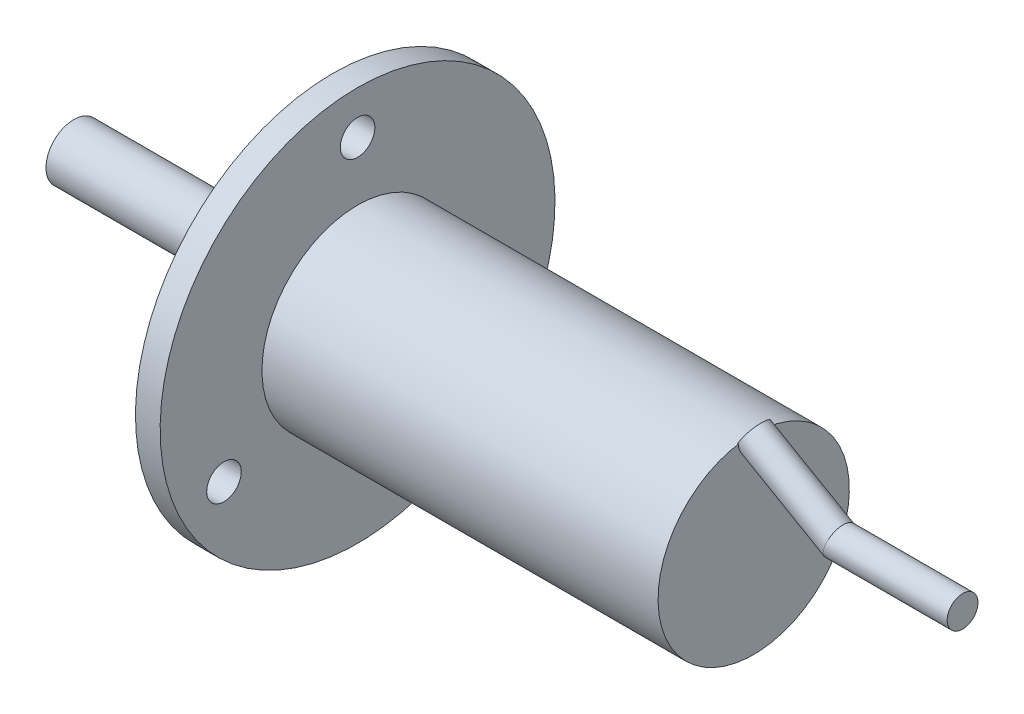
ISO-10303-21;
HEADER;
FILE_DESCRIPTION(('STEP AP214'),'2;1');
FILE_NAME('part.step','',(''),(''),'','','');
FILE_SCHEMA(('AUTOMOTIVE_DESIGN { 1 0 10303 214 1 1 1 1 }'));
ENDSEC;
DATA;
#1=APPLICATION_CONTEXT('core data for automotive mechanical design processes');
#2=APPLICATION_PROTOCOL_DEFINITION('international standard','automotive_design',2000,#1);
#3=PRODUCT_CONTEXT('',#1,'mechanical');
#4=PRODUCT('Part','Part','',(#3));
#5=PRODUCT_RELATED_PRODUCT_CATEGORY('part','',(#4));
#6=PRODUCT_DEFINITION_FORMATION('','',#4);
#7=PRODUCT_DEFINITION_CONTEXT('part definition',#1,'design');
#8=PRODUCT_DEFINITION('design','',#6,#7);
#9=PRODUCT_DEFINITION_SHAPE('','',#8);
#10=(LENGTH_UNIT() NAMED_UNIT(*) SI_UNIT(.MILLI.,.METRE.));
#11=(NAMED_UNIT(*) PLANE_ANGLE_UNIT() SI_UNIT($,.RADIAN.));
#12=(NAMED_UNIT(*) SI_UNIT($,.STERADIAN.) SOLID_ANGLE_UNIT());
#13=UNCERTAINTY_MEASURE_WITH_UNIT(LENGTH_MEASURE(1.E-05),#10,'distance_accuracy_value','');
#14=(GEOMETRIC_REPRESENTATION_CONTEXT(3) GLOBAL_UNCERTAINTY_ASSIGNED_CONTEXT((#13)) GLOBAL_UNIT_ASSIGNED_CONTEXT((#10,
#11,#12)) REPRESENTATION_CONTEXT('',''));
#15=CARTESIAN_POINT('',(0.,0.,0.));
#16=DIRECTION('',(0.,0.,1.));
#17=DIRECTION('',(1.,0.,0.));
#18=AXIS2_PLACEMENT_3D('',#15,#16,#17);
#19=CARTESIAN_POINT('',(57.0282032302755,3.75000000000002,0.));
#20=DIRECTION('',(-1.,0.,0.));
#21=DIRECTION('',(0.,-1.,0.));
#22=AXIS2_PLACEMENT_3D('',#19,#20,#21);
#23=PLANE('',#22);
#24=CARTESIAN_POINT('',(57.0282032302755,3.75000000000002,0.));
#25=DIRECTION('',(-1.,0.,0.));
#26=DIRECTION('',(0.,-1.,0.));
#27=AXIS2_PLACEMENT_3D('',#24,#25,#26);
#28=CIRCLE('',#27,1.25);
#29=CARTESIAN_POINT('',(57.0282032302755,2.50000000000002,0.));
#30=VERTEX_POINT('',#29);
#31=EDGE_CURVE('E59',#30,#30,#28,.T.);
#32=ORIENTED_EDGE('',*,*,#31,.F.);
#33=EDGE_LOOP('',(#32));
#34=FACE_BOUND('',#33,.T.);
#35=ADVANCED_FACE('F56',(#34),#23,.F.);
#36=CARTESIAN_POINT('',(40.1,7.75,0.));
#37=DIRECTION('',(-0.86602540378444,0.499999999999997,0.));
#38=DIRECTION('',(-0.499999999999997,-0.86602540378444,0.));
#39=AXIS2_PLACEMENT_3D('',#36,#37,#38);
#40=PLANE('',#39);
#41=CARTESIAN_POINT('',(40.1,7.75,0.));
#42=DIRECTION('',(-0.86602540378444,0.499999999999997,0.));
#43=DIRECTION('',(-0.499999999999997,-0.86602540378444,0.));
#44=AXIS2_PLACEMENT_3D('',#41,#42,#43);
#45=CIRCLE('',#44,1.25);
#46=CARTESIAN_POINT('',(39.475,6.66746824526945,0.));
#47=VERTEX_POINT('',#46);
#48=EDGE_CURVE('E63',#47,#47,#45,.T.);
#49=ORIENTED_EDGE('',*,*,#48,.T.);
#50=EDGE_LOOP('',(#49));
#51=FACE_BOUND('',#50,.T.);
#52=ADVANCED_FACE('F76',(#51),#40,.T.);
#53=CARTESIAN_POINT('',(46.5597730906827,3.75000000000002,0.));
#54=DIRECTION('',(1.,0.,0.));
#55=DIRECTION('',(0.,1.,0.));
#56=AXIS2_PLACEMENT_3D('',#53,#54,#55);
#57=CYLINDRICAL_SURFACE('',#56,1.25);
#58=CARTESIAN_POINT('',(47.0282032302755,3.75000000000002,0.));
#59=DIRECTION('',(0.965925826289069,-0.258819045102519,0.));
#60=DIRECTION('',(-0.258819045102519,-0.965925826289069,0.));
#61=AXIS2_PLACEMENT_3D('',#58,#59,#60);
#62=ELLIPSE('',#61,1.2940952255126,1.25);
#63=CARTESIAN_POINT('',(46.6932667397366,2.50000000000002,0.));
#64=VERTEX_POINT('',#63);
#65=EDGE_CURVE('E12',#64,#64,#62,.T.);
#66=ORIENTED_EDGE('',*,*,#65,.T.);
#67=EDGE_LOOP('',(#66));
#68=FACE_BOUND('',#67,.T.);
#69=ORIENTED_EDGE('',*,*,#31,.T.);
#70=EDGE_LOOP('',(#69));
#71=FACE_BOUND('',#70,.T.);
#72=ADVANCED_FACE('F73',(#68,#71),#57,.T.);
#73=CARTESIAN_POINT('',(40.1,7.75,0.));
#74=DIRECTION('',(0.86602540378444,-0.499999999999998,0.));
#75=DIRECTION('',(0.499999999999998,0.86602540378444,0.));
#76=AXIS2_PLACEMENT_3D('',#73,#74,#75);
#77=CYLINDRICAL_SURFACE('',#76,1.25);
#78=ORIENTED_EDGE('',*,*,#48,.F.);
#79=EDGE_LOOP('',(#78));
#80=FACE_BOUND('',#79,.T.);
#81=ORIENTED_EDGE('',*,*,#65,.F.);
#82=EDGE_LOOP('',(#81));
#83=FACE_BOUND('',#82,.T.);
#84=ADVANCED_FACE('F80',(#80,#83),#77,.T.);
#85=CLOSED_SHELL('',(#35,#52,#72,#84));
#86=MANIFOLD_SOLID_BREP('B2',#85);
#87=CARTESIAN_POINT('',(-15.,0.,0.));
#88=DIRECTION('',(1.,0.,0.));
#89=DIRECTION('',(0.,1.,0.));
#90=AXIS2_PLACEMENT_3D('',#87,#88,#89);
#91=CYLINDRICAL_SURFACE('',#90,2.25);
#92=CARTESIAN_POINT('',(-15.,0.,0.));
#93=DIRECTION('',(-1.,0.,0.));
#94=DIRECTION('',(0.,-1.,0.));
#95=AXIS2_PLACEMENT_3D('',#92,#93,#94);
#96=CIRCLE('',#95,2.25);
#97=CARTESIAN_POINT('',(-15.,-2.25,0.));
#98=VERTEX_POINT('',#97);
#99=EDGE_CURVE('E55',#98,#98,#96,.T.);
#100=ORIENTED_EDGE('',*,*,#99,.F.);
#101=EDGE_LOOP('',(#100));
#102=FACE_BOUND('',#101,.T.);
#103=CARTESIAN_POINT('',(0.,0.,0.));
#104=DIRECTION('',(-1.,0.,0.));
#105=DIRECTION('',(0.,-1.,0.));
#106=AXIS2_PLACEMENT_3D('',#103,#104,#105);
#107=CIRCLE('',#106,2.25);
#108=CARTESIAN_POINT('',(0.,-2.25,0.));
#109=VERTEX_POINT('',#108);
#110=EDGE_CURVE('E122',#109,#109,#107,.T.);
#111=ORIENTED_EDGE('',*,*,#110,.T.);
#112=EDGE_LOOP('',(#111));
#113=FACE_BOUND('',#112,.T.);
#114=ADVANCED_FACE('F119',(#102,#113),#91,.T.);
#115=CARTESIAN_POINT('',(-15.,0.,0.));
#116=DIRECTION('',(-1.,0.,0.));
#117=DIRECTION('',(0.,-1.,0.));
#118=AXIS2_PLACEMENT_3D('',#115,#116,#117);
#119=PLANE('',#118);
#120=ORIENTED_EDGE('',*,*,#99,.T.);
#121=EDGE_LOOP('',(#120));
#122=FACE_BOUND('',#121,.T.);
#123=ADVANCED_FACE('F134',(#122),#119,.T.);
#124=CARTESIAN_POINT('',(0.,0.,0.));
#125=DIRECTION('',(-1.,0.,0.));
#126=DIRECTION('',(0.,-1.,0.));
#127=AXIS2_PLACEMENT_3D('',#124,#125,#126);
#128=PLANE('',#127);
#129=ORIENTED_EDGE('',*,*,#110,.F.);
#130=EDGE_LOOP('',(#129));
#131=FACE_BOUND('',#130,.T.);
#132=ADVANCED_FACE('F132',(#131),#128,.F.);
#133=CLOSED_SHELL('',(#114,#123,#132));
#134=MANIFOLD_SOLID_BREP('B7',#133);
#135=CARTESIAN_POINT('',(0.,0.,0.));
#136=DIRECTION('',(-1.,0.,0.));
#137=DIRECTION('',(0.,-1.,0.));
#138=AXIS2_PLACEMENT_3D('',#135,#136,#137);
#139=PLANE('',#138);
#140=CARTESIAN_POINT('',(0.,0.,0.));
#141=DIRECTION('',(1.,0.,0.));
#142=DIRECTION('',(0.,1.,0.));
#143=AXIS2_PLACEMENT_3D('',#140,#141,#142);
#144=CIRCLE('',#143,2.99999999999999);
#145=CARTESIAN_POINT('',(0.,2.99999999999999,0.));
#146=VERTEX_POINT('',#145);
#147=EDGE_CURVE('E118',#146,#146,#144,.T.);
#148=ORIENTED_EDGE('',*,*,#147,.F.);
#149=EDGE_LOOP('',(#148));
#150=FACE_BOUND('',#149,.T.);
#151=ADVANCED_FACE('F160',(#150),#139,.T.);
#152=CARTESIAN_POINT('',(40.1,0.,0.));
#153=DIRECTION('',(1.,0.,0.));
#154=DIRECTION('',(0.,1.,0.));
#155=AXIS2_PLACEMENT_3D('',#152,#153,#154);
#156=CYLINDRICAL_SURFACE('',#155,2.99999999999999);
#157=ORIENTED_EDGE('',*,*,#147,.T.);
#158=EDGE_LOOP('',(#157));
#159=FACE_BOUND('',#158,.T.);
#160=CARTESIAN_POINT('',(6.,0.,0.));
#161=DIRECTION('',(1.,0.,0.));
#162=DIRECTION('',(0.,1.,0.));
#163=AXIS2_PLACEMENT_3D('',#160,#161,#162);
#164=CIRCLE('',#163,2.99999999999999);
#165=CARTESIAN_POINT('',(6.,2.99999999999999,0.));
#166=VERTEX_POINT('',#165);
#167=EDGE_CURVE('E167',#166,#166,#164,.T.);
#168=ORIENTED_EDGE('',*,*,#167,.F.);
#169=EDGE_LOOP('',(#168));
#170=FACE_BOUND('',#169,.T.);
#171=ADVANCED_FACE('F208',(#159,#170),#156,.T.);
#172=CARTESIAN_POINT('',(6.,2.99999999999999,0.));
#173=DIRECTION('',(-1.,0.,0.));
#174=DIRECTION('',(0.,-1.,0.));
#175=AXIS2_PLACEMENT_3D('',#172,#173,#174);
#176=PLANE('',#175);
#177=CARTESIAN_POINT('',(6.,12.5,0.));
#178=DIRECTION('',(-1.,0.,0.));
#179=DIRECTION('',(0.,-1.,0.));
#180=AXIS2_PLACEMENT_3D('',#177,#178,#179);
#181=CIRCLE('',#180,1.4);
#182=CARTESIAN_POINT('',(6.,11.1,0.));
#183=VERTEX_POINT('',#182);
#184=EDGE_CURVE('E179',#183,#183,#181,.T.);
#185=ORIENTED_EDGE('',*,*,#184,.F.);
#186=EDGE_LOOP('',(#185));
#187=FACE_BOUND('',#186,.T.);
#188=CARTESIAN_POINT('',(6.,-6.25,10.8253175473055));
#189=DIRECTION('',(-1.,0.,0.));
#190=DIRECTION('',(0.,-1.,0.));
#191=AXIS2_PLACEMENT_3D('',#188,#189,#190);
#192=CIRCLE('',#191,1.40000000000006);
#193=CARTESIAN_POINT('',(6.,-7.65000000000006,10.8253175473055));
#194=VERTEX_POINT('',#193);
#195=EDGE_CURVE('E299',#194,#194,#192,.T.);
#196=ORIENTED_EDGE('',*,*,#195,.F.);
#197=EDGE_LOOP('',(#196));
#198=FACE_BOUND('',#197,.T.);
#199=CARTESIAN_POINT('',(6.,-6.25,-10.8253175473055));
#200=DIRECTION('',(-1.,0.,0.));
#201=DIRECTION('',(0.,-1.,0.));
#202=AXIS2_PLACEMENT_3D('',#199,#200,#201);
#203=CIRCLE('',#202,1.40000000000012);
#204=CARTESIAN_POINT('',(6.,-7.65000000000012,-10.8253175473055));
#205=VERTEX_POINT('',#204);
#206=EDGE_CURVE('E196',#205,#205,#203,.T.);
#207=ORIENTED_EDGE('',*,*,#206,.F.);
#208=EDGE_LOOP('',(#207));
#209=FACE_BOUND('',#208,.T.);
#210=ORIENTED_EDGE('',*,*,#167,.T.);
#211=EDGE_LOOP('',(#210));
#212=FACE_BOUND('',#211,.T.);
#213=CARTESIAN_POINT('',(6.,0.,0.));
#214=DIRECTION('',(1.,0.,0.));
#215=DIRECTION('',(0.,1.,0.));
#216=AXIS2_PLACEMENT_3D('',#213,#214,#215);
#217=CIRCLE('',#216,16.);
#218=CARTESIAN_POINT('',(6.,16.,0.));
#219=VERTEX_POINT('',#218);
#220=EDGE_CURVE('E172',#219,#219,#217,.T.);
#221=ORIENTED_EDGE('',*,*,#220,.F.);
#222=EDGE_LOOP('',(#221));
#223=FACE_BOUND('',#222,.T.);
#224=ADVANCED_FACE('F206',(#187,#198,#209,#212,#223),#176,.T.);
#225=CARTESIAN_POINT('',(40.1,0.,0.));
#226=DIRECTION('',(1.,0.,0.));
#227=DIRECTION('',(0.,1.,0.));
#228=AXIS2_PLACEMENT_3D('',#225,#226,#227);
#229=CYLINDRICAL_SURFACE('',#228,16.);
#230=ORIENTED_EDGE('',*,*,#220,.T.);
#231=EDGE_LOOP('',(#230));
#232=FACE_BOUND('',#231,.T.);
#233=CARTESIAN_POINT('',(8.,0.,0.));
#234=DIRECTION('',(1.,0.,0.));
#235=DIRECTION('',(0.,1.,0.));
#236=AXIS2_PLACEMENT_3D('',#233,#234,#235);
#237=CIRCLE('',#236,16.);
#238=CARTESIAN_POINT('',(8.,16.,0.));
#239=VERTEX_POINT('',#238);
#240=EDGE_CURVE('E193',#239,#239,#237,.T.);
#241=ORIENTED_EDGE('',*,*,#240,.F.);
#242=EDGE_LOOP('',(#241));
#243=FACE_BOUND('',#242,.T.);
#244=ADVANCED_FACE('F203',(#232,#243),#229,.T.);
#245=CARTESIAN_POINT('',(8.,16.,0.));
#246=DIRECTION('',(1.,0.,0.));
#247=DIRECTION('',(0.,1.,0.));
#248=AXIS2_PLACEMENT_3D('',#245,#246,#247);
#249=PLANE('',#248);
#250=CARTESIAN_POINT('',(8.00000000000001,12.5,0.));
#251=DIRECTION('',(1.,0.,0.));
#252=DIRECTION('',(0.,1.,0.));
#253=AXIS2_PLACEMENT_3D('',#250,#251,#252);
#254=CIRCLE('',#253,1.4);
#255=CARTESIAN_POINT('',(8.00000000000001,13.9,0.));
#256=VERTEX_POINT('',#255);
#257=EDGE_CURVE('E163',#256,#256,#254,.T.);
#258=ORIENTED_EDGE('',*,*,#257,.F.);
#259=EDGE_LOOP('',(#258));
#260=FACE_BOUND('',#259,.T.);
#261=CARTESIAN_POINT('',(8.00000000000001,-6.25,10.8253175473055));
#262=DIRECTION('',(1.,0.,0.));
#263=DIRECTION('',(0.,1.,0.));
#264=AXIS2_PLACEMENT_3D('',#261,#262,#263);
#265=CIRCLE('',#264,1.40000000000006);
#266=CARTESIAN_POINT('',(8.00000000000001,-4.84999999999994,10.8253175473055));
#267=VERTEX_POINT('',#266);
#268=EDGE_CURVE('E178',#267,#267,#265,.T.);
#269=ORIENTED_EDGE('',*,*,#268,.F.);
#270=EDGE_LOOP('',(#269));
#271=FACE_BOUND('',#270,.T.);
#272=CARTESIAN_POINT('',(8.00000000000001,-6.25,-10.8253175473055));
#273=DIRECTION('',(1.,0.,0.));
#274=DIRECTION('',(0.,1.,0.));
#275=AXIS2_PLACEMENT_3D('',#272,#273,#274);
#276=CIRCLE('',#275,1.40000000000012);
#277=CARTESIAN_POINT('',(8.00000000000001,-4.84999999999989,-10.8253175473055));
#278=VERTEX_POINT('',#277);
#279=EDGE_CURVE('E176',#278,#278,#276,.T.);
#280=ORIENTED_EDGE('',*,*,#279,.F.);
#281=EDGE_LOOP('',(#280));
#282=FACE_BOUND('',#281,.T.);
#283=ORIENTED_EDGE('',*,*,#240,.T.);
#284=EDGE_LOOP('',(#283));
#285=FACE_BOUND('',#284,.T.);
#286=CARTESIAN_POINT('',(8.00000000000001,0.,0.));
#287=DIRECTION('',(1.,0.,0.));
#288=DIRECTION('',(0.,1.,0.));
#289=AXIS2_PLACEMENT_3D('',#286,#287,#288);
#290=CIRCLE('',#289,7.75);
#291=CARTESIAN_POINT('',(8.00000000000001,7.75,0.));
#292=VERTEX_POINT('',#291);
#293=EDGE_CURVE('E188',#292,#292,#290,.T.);
#294=ORIENTED_EDGE('',*,*,#293,.F.);
#295=EDGE_LOOP('',(#294));
#296=FACE_BOUND('',#295,.T.);
#297=ADVANCED_FACE('F215',(#260,#271,#282,#285,#296),#249,.T.);
#298=CARTESIAN_POINT('',(40.1,0.,0.));
#299=DIRECTION('',(1.,0.,0.));
#300=DIRECTION('',(0.,1.,0.));
#301=AXIS2_PLACEMENT_3D('',#298,#299,#300);
#302=CYLINDRICAL_SURFACE('',#301,7.75);
#303=ORIENTED_EDGE('',*,*,#293,.T.);
#304=EDGE_LOOP('',(#303));
#305=FACE_BOUND('',#304,.T.);
#306=CARTESIAN_POINT('',(40.1,0.,0.));
#307=DIRECTION('',(1.,0.,0.));
#308=DIRECTION('',(0.,1.,0.));
#309=AXIS2_PLACEMENT_3D('',#306,#307,#308);
#310=CIRCLE('',#309,7.75);
#311=CARTESIAN_POINT('',(40.1,7.75,0.));
#312=VERTEX_POINT('',#311);
#313=EDGE_CURVE('E184',#312,#312,#310,.T.);
#314=ORIENTED_EDGE('',*,*,#313,.F.);
#315=EDGE_LOOP('',(#314));
#316=FACE_BOUND('',#315,.T.);
#317=ADVANCED_FACE('F241',(#305,#316),#302,.T.);
#318=CARTESIAN_POINT('',(40.1,7.75,0.));
#319=DIRECTION('',(1.,0.,0.));
#320=DIRECTION('',(0.,1.,0.));
#321=AXIS2_PLACEMENT_3D('',#318,#319,#320);
#322=PLANE('',#321);
#323=ORIENTED_EDGE('',*,*,#313,.T.);
#324=EDGE_LOOP('',(#323));
#325=FACE_BOUND('',#324,.T.);
#326=ADVANCED_FACE('F246',(#325),#322,.T.);
#327=CARTESIAN_POINT('',(40.1,-6.25,-10.8253175473055));
#328=DIRECTION('',(-1.,0.,0.));
#329=DIRECTION('',(0.,-1.,0.));
#330=AXIS2_PLACEMENT_3D('',#327,#328,#329);
#331=CYLINDRICAL_SURFACE('',#330,1.40000000000012);
#332=ORIENTED_EDGE('',*,*,#279,.T.);
#333=EDGE_LOOP('',(#332));
#334=FACE_BOUND('',#333,.T.);
#335=ORIENTED_EDGE('',*,*,#206,.T.);
#336=EDGE_LOOP('',(#335));
#337=FACE_BOUND('',#336,.T.);
#338=ADVANCED_FACE('F255',(#334,#337),#331,.F.);
#339=CARTESIAN_POINT('',(40.1,-6.25,10.8253175473055));
#340=DIRECTION('',(-1.,0.,0.));
#341=DIRECTION('',(0.,-1.,0.));
#342=AXIS2_PLACEMENT_3D('',#339,#340,#341);
#343=CYLINDRICAL_SURFACE('',#342,1.40000000000006);
#344=ORIENTED_EDGE('',*,*,#268,.T.);
#345=EDGE_LOOP('',(#344));
#346=FACE_BOUND('',#345,.T.);
#347=ORIENTED_EDGE('',*,*,#195,.T.);
#348=EDGE_LOOP('',(#347));
#349=FACE_BOUND('',#348,.T.);
#350=ADVANCED_FACE('F275',(#346,#349),#343,.F.);
#351=CARTESIAN_POINT('',(40.1,12.5,0.));
#352=DIRECTION('',(-1.,0.,0.));
#353=DIRECTION('',(0.,-1.,0.));
#354=AXIS2_PLACEMENT_3D('',#351,#352,#353);
#355=CYLINDRICAL_SURFACE('',#354,1.4);
#356=ORIENTED_EDGE('',*,*,#257,.T.);
#357=EDGE_LOOP('',(#356));
#358=FACE_BOUND('',#357,.T.);
#359=ORIENTED_EDGE('',*,*,#184,.T.);
#360=EDGE_LOOP('',(#359));
#361=FACE_BOUND('',#360,.T.);
#362=ADVANCED_FACE('F285',(#358,#361),#355,.F.);
#363=CLOSED_SHELL('',(#151,#171,#224,#244,#297,#317,#326,#338,#350,#362));
#364=MANIFOLD_SOLID_BREP('B50',#363);
#365=ADVANCED_BREP_SHAPE_REPRESENTATION('',(#18,#86,#134,#364),#14);
#366=SHAPE_DEFINITION_REPRESENTATION(#9,#365);
ENDSEC;
END-ISO-10303-21;
